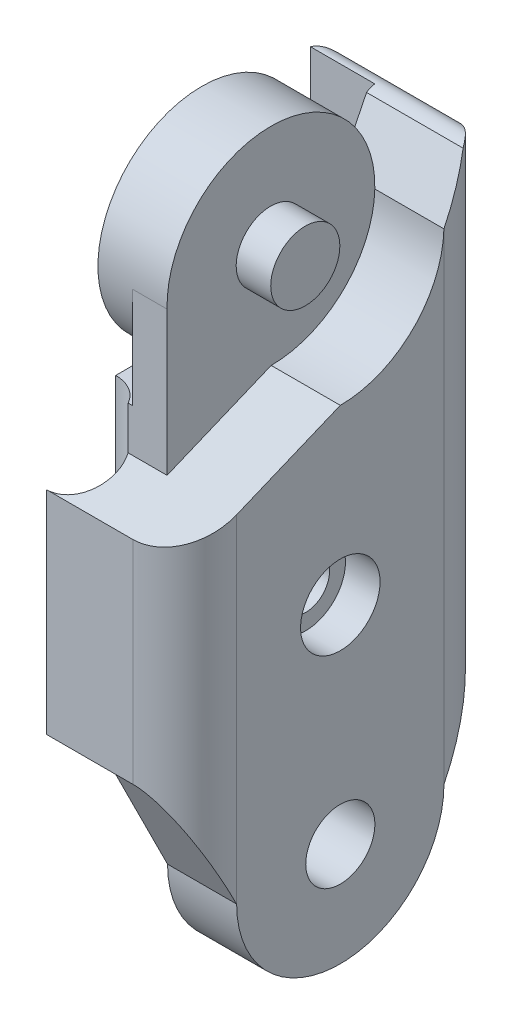
ISO-10303-21;
HEADER;
FILE_DESCRIPTION(('STEP AP214'),'2;1');
FILE_NAME('part.step','',(''),(''),'','','');
FILE_SCHEMA(('AUTOMOTIVE_DESIGN { 1 0 10303 214 1 1 1 1 }'));
ENDSEC;
DATA;
#1=APPLICATION_CONTEXT('core data for automotive mechanical design processes');
#2=APPLICATION_PROTOCOL_DEFINITION('international standard','automotive_design',2000,#1);
#3=PRODUCT_CONTEXT('',#1,'mechanical');
#4=PRODUCT('Part','Part','',(#3));
#5=PRODUCT_RELATED_PRODUCT_CATEGORY('part','',(#4));
#6=PRODUCT_DEFINITION_FORMATION('','',#4);
#7=PRODUCT_DEFINITION_CONTEXT('part definition',#1,'design');
#8=PRODUCT_DEFINITION('design','',#6,#7);
#9=PRODUCT_DEFINITION_SHAPE('','',#8);
#10=(LENGTH_UNIT() NAMED_UNIT(*) SI_UNIT(.MILLI.,.METRE.));
#11=(NAMED_UNIT(*) PLANE_ANGLE_UNIT() SI_UNIT($,.RADIAN.));
#12=(NAMED_UNIT(*) SI_UNIT($,.STERADIAN.) SOLID_ANGLE_UNIT());
#13=UNCERTAINTY_MEASURE_WITH_UNIT(LENGTH_MEASURE(1.E-05),#10,'distance_accuracy_value','');
#14=(GEOMETRIC_REPRESENTATION_CONTEXT(3) GLOBAL_UNCERTAINTY_ASSIGNED_CONTEXT((#13)) GLOBAL_UNIT_ASSIGNED_CONTEXT((#10,
#11,#12)) REPRESENTATION_CONTEXT('',''));
#15=CARTESIAN_POINT('',(0.,0.,0.));
#16=DIRECTION('',(0.,0.,1.));
#17=DIRECTION('',(1.,0.,0.));
#18=AXIS2_PLACEMENT_3D('',#15,#16,#17);
#19=CARTESIAN_POINT('',(10.668,22.86,-19.475319289495));
#20=DIRECTION('',(-1.,0.,0.));
#21=DIRECTION('',(0.,0.,1.));
#22=AXIS2_PLACEMENT_3D('',#19,#20,#21);
#23=CYLINDRICAL_SURFACE('',#22,1.7526);
#24=CARTESIAN_POINT('',(-10.16,22.86,-19.475319289495));
#25=DIRECTION('',(-1.,0.,0.));
#26=DIRECTION('',(0.,0.,1.));
#27=AXIS2_PLACEMENT_3D('',#24,#25,#26);
#28=CIRCLE('',#27,1.7526);
#29=CARTESIAN_POINT('',(-10.16,22.86,-17.722719289495));
#30=VERTEX_POINT('',#29);
#31=EDGE_CURVE('E207',#30,#30,#28,.T.);
#32=ORIENTED_EDGE('',*,*,#31,.T.);
#33=EDGE_LOOP('',(#32));
#34=FACE_BOUND('',#33,.T.);
#35=CARTESIAN_POINT('',(-2.54,22.86,-19.475319289495));
#36=DIRECTION('',(1.,0.,0.));
#37=DIRECTION('',(0.,0.,-1.));
#38=AXIS2_PLACEMENT_3D('',#35,#36,#37);
#39=CIRCLE('',#38,1.7526);
#40=CARTESIAN_POINT('',(-2.54,22.86,-21.227919289495));
#41=VERTEX_POINT('',#40);
#42=EDGE_CURVE('E44',#41,#41,#39,.F.);
#43=ORIENTED_EDGE('',*,*,#42,.F.);
#44=EDGE_LOOP('',(#43));
#45=FACE_BOUND('',#44,.T.);
#46=ADVANCED_FACE('F40',(#34,#45),#23,.F.);
#47=CARTESIAN_POINT('',(-7.61999999999998,35.56,-58.845319289495));
#48=DIRECTION('',(0.,-1.,0.));
#49=DIRECTION('',(0.,0.,-1.));
#50=AXIS2_PLACEMENT_3D('',#47,#48,#49);
#51=PLANE('',#50);
#52=DIRECTION('',(1.,0.,0.));
#53=VECTOR('',#52,1.);
#54=CARTESIAN_POINT('',(-10.16,35.56,-20.1996134735618));
#55=LINE('',#54,#53);
#56=CARTESIAN_POINT('',(-7.61999999999998,35.56,-20.1996134735618));
#57=VERTEX_POINT('',#56);
#58=CARTESIAN_POINT('',(-10.16,35.56,-20.1996134735618));
#59=VERTEX_POINT('',#58);
#60=EDGE_CURVE('E360',#57,#59,#55,.F.);
#61=ORIENTED_EDGE('',*,*,#60,.F.);
#62=DIRECTION('',(0.,0.,1.));
#63=VECTOR('',#62,1.);
#64=CARTESIAN_POINT('',(-7.61999999999998,35.56,-58.845319289495));
#65=LINE('',#64,#63);
#66=CARTESIAN_POINT('',(-7.61999999999998,35.56,-29.635319289495));
#67=VERTEX_POINT('',#66);
#68=EDGE_CURVE('E443',#67,#57,#65,.T.);
#69=ORIENTED_EDGE('',*,*,#68,.F.);
#70=DIRECTION('',(1.,0.,0.));
#71=VECTOR('',#70,1.);
#72=CARTESIAN_POINT('',(-12.7,35.56,-29.635319289495));
#73=LINE('',#72,#71);
#74=CARTESIAN_POINT('',(-10.16,35.56,-29.635319289495));
#75=VERTEX_POINT('',#74);
#76=EDGE_CURVE('E226',#75,#67,#73,.T.);
#77=ORIENTED_EDGE('',*,*,#76,.F.);
#78=CARTESIAN_POINT('',(-10.16,35.56,-28.365319289495));
#79=DIRECTION('',(0.,-1.,0.));
#80=DIRECTION('',(0.,0.,-1.));
#81=AXIS2_PLACEMENT_3D('',#78,#79,#80);
#82=CIRCLE('',#81,1.27);
#83=EDGE_CURVE('E439',#75,#75,#82,.F.);
#84=ORIENTED_EDGE('',*,*,#83,.F.);
#85=CARTESIAN_POINT('',(-12.3597045256125,35.56,-29.635319289495));
#86=VERTEX_POINT('',#85);
#87=EDGE_CURVE('E63',#86,#75,#73,.T.);
#88=ORIENTED_EDGE('',*,*,#87,.F.);
#89=CARTESIAN_POINT('',(-10.16,35.56,-28.365319289495));
#90=DIRECTION('',(0.,-1.,0.));
#91=DIRECTION('',(0.,0.,-1.));
#92=AXIS2_PLACEMENT_3D('',#89,#90,#91);
#93=CIRCLE('',#92,2.54);
#94=CARTESIAN_POINT('',(-10.16,35.56,-25.825319289495));
#95=VERTEX_POINT('',#94);
#96=EDGE_CURVE('E56',#86,#95,#93,.F.);
#97=ORIENTED_EDGE('',*,*,#96,.T.);
#98=DIRECTION('',(0.,0.,1.));
#99=VECTOR('',#98,1.);
#100=CARTESIAN_POINT('',(-10.16,35.56,-58.845319289495));
#101=LINE('',#100,#99);
#102=EDGE_CURVE('E213',#95,#59,#101,.T.);
#103=ORIENTED_EDGE('',*,*,#102,.T.);
#104=EDGE_LOOP('',(#61,#69,#77,#84,#88,#97,#103));
#105=FACE_BOUND('',#104,.T.);
#106=ADVANCED_FACE('F285',(#105),#51,.F.);
#107=CARTESIAN_POINT('',(-7.61999999999998,50.8,-58.845319289495));
#108=DIRECTION('',(1.,0.,0.));
#109=DIRECTION('',(0.,1.,0.));
#110=AXIS2_PLACEMENT_3D('',#107,#108,#109);
#111=PLANE('',#110);
#112=CARTESIAN_POINT('',(-7.61999999999998,43.1619185849693,-19.4572378744643));
#113=DIRECTION('',(-1.,0.,0.));
#114=DIRECTION('',(0.,-1.,0.));
#115=AXIS2_PLACEMENT_3D('',#112,#113,#114);
#116=CIRCLE('',#115,7.63808141503068);
#117=CARTESIAN_POINT('',(-7.61999999999998,42.986705665976,-27.093309386417));
#118=VERTEX_POINT('',#117);
#119=EDGE_CURVE('E367',#118,#57,#116,.T.);
#120=ORIENTED_EDGE('',*,*,#119,.F.);
#121=DIRECTION('',(0.,0.896202517851149,-0.443645181420087));
#122=VECTOR('',#121,1.);
#123=CARTESIAN_POINT('',(-7.61999999999998,42.9857641827755,-27.0928433260378));
#124=LINE('',#123,#122);
#125=CARTESIAN_POINT('',(-7.61999999999998,46.8928820913877,-29.0269753987217));
#126=VERTEX_POINT('',#125);
#127=EDGE_CURVE('E232',#118,#126,#124,.T.);
#128=ORIENTED_EDGE('',*,*,#127,.T.);
#129=CARTESIAN_POINT('',(-7.61999999999998,45.9354329019638,-29.7570594411049));
#130=DIRECTION('',(1.,0.,0.));
#131=DIRECTION('',(0.,0.,-1.));
#132=AXIS2_PLACEMENT_3D('',#129,#130,#131);
#133=CIRCLE('',#132,1.20404803030072);
#134=CARTESIAN_POINT('',(-7.61999999999998,47.1333106063882,-29.635319289495));
#135=VERTEX_POINT('',#134);
#136=EDGE_CURVE('E231',#126,#135,#133,.F.);
#137=ORIENTED_EDGE('',*,*,#136,.T.);
#138=DIRECTION('',(0.,1.,0.));
#139=VECTOR('',#138,1.);
#140=CARTESIAN_POINT('',(-7.61999999999998,35.56,-29.635319289495));
#141=LINE('',#140,#139);
#142=EDGE_CURVE('E228',#67,#135,#141,.T.);
#143=ORIENTED_EDGE('',*,*,#142,.F.);
#144=ORIENTED_EDGE('',*,*,#68,.T.);
#145=EDGE_LOOP('',(#120,#128,#137,#143,#144));
#146=FACE_BOUND('',#145,.T.);
#147=ADVANCED_FACE('F291',(#146),#111,.F.);
#148=CARTESIAN_POINT('',(-7.61999999999998,35.56,-18.7148622753669));
#149=VERTEX_POINT('',#148);
#150=CARTESIAN_POINT('',(-7.61999999999999,35.56,-11.8215590442311));
#151=VERTEX_POINT('',#150);
#152=EDGE_CURVE('E442',#149,#151,#65,.T.);
#153=ORIENTED_EDGE('',*,*,#152,.T.);
#154=DIRECTION('',(0.,1.,0.));
#155=VECTOR('',#154,1.);
#156=CARTESIAN_POINT('',(-7.61999999999999,42.9703552686348,-11.8215590442311));
#157=LINE('',#156,#155);
#158=CARTESIAN_POINT('',(-7.61999999999999,42.9703552686348,-11.8215590442311));
#159=VERTEX_POINT('',#158);
#160=EDGE_CURVE('E198',#151,#159,#157,.T.);
#161=ORIENTED_EDGE('',*,*,#160,.T.);
#162=EDGE_CURVE('E364',#149,#159,#116,.T.);
#163=ORIENTED_EDGE('',*,*,#162,.F.);
#164=EDGE_LOOP('',(#153,#161,#163));
#165=FACE_BOUND('',#164,.T.);
#166=ADVANCED_FACE('F559',(#165),#111,.F.);
#167=CARTESIAN_POINT('',(0.,42.9857641827755,-27.0928433260378));
#168=DIRECTION('',(0.,0.443645181420087,0.896202517851149));
#169=DIRECTION('',(0.,-0.896202517851149,0.443645181420087));
#170=AXIS2_PLACEMENT_3D('',#167,#168,#169);
#171=PLANE('',#170);
#172=ORIENTED_EDGE('',*,*,#127,.F.);
#173=DIRECTION('',(-1.,0.,0.));
#174=VECTOR('',#173,1.);
#175=CARTESIAN_POINT('',(30.48,42.986705665976,-27.093309386417));
#176=LINE('',#175,#174);
#177=CARTESIAN_POINT('',(-5.07999999999999,42.986705665976,-27.093309386417));
#178=VERTEX_POINT('',#177);
#179=EDGE_CURVE('E436',#178,#118,#176,.T.);
#180=ORIENTED_EDGE('',*,*,#179,.F.);
#181=DIRECTION('',(0.,0.896202517851149,-0.443645181420087));
#182=VECTOR('',#181,1.);
#183=CARTESIAN_POINT('',(-5.07999999999998,61.8866490916838,-36.4493072361354));
#184=LINE('',#183,#182);
#185=CARTESIAN_POINT('',(-5.07999999999999,42.9857641827755,-27.0928433260378));
#186=VERTEX_POINT('',#185);
#187=EDGE_CURVE('E434',#186,#178,#184,.T.);
#188=ORIENTED_EDGE('',*,*,#187,.F.);
#189=DIRECTION('',(-1.,0.,0.));
#190=VECTOR('',#189,1.);
#191=CARTESIAN_POINT('',(0.,42.9857641827755,-27.0928433260378));
#192=LINE('',#191,#190);
#193=CARTESIAN_POINT('',(0.,42.9857641827755,-27.0928433260378));
#194=VERTEX_POINT('',#193);
#195=EDGE_CURVE('E420',#194,#186,#192,.T.);
#196=ORIENTED_EDGE('',*,*,#195,.F.);
#197=DIRECTION('',(0.,0.896202517851148,-0.443645181420087));
#198=VECTOR('',#197,1.);
#199=CARTESIAN_POINT('',(0.,42.9857641827755,-27.0928433260378));
#200=LINE('',#199,#198);
#201=CARTESIAN_POINT('',(0.,42.9907658480192,-27.095319289495));
#202=VERTEX_POINT('',#201);
#203=EDGE_CURVE('E415',#194,#202,#200,.T.);
#204=ORIENTED_EDGE('',*,*,#203,.T.);
#205=CARTESIAN_POINT('',(-3.81,42.9907658480192,-27.095319289495));
#206=DIRECTION('',(0.,0.443645181420087,0.896202517851149));
#207=DIRECTION('',(0.,-0.896202517851149,0.443645181420087));
#208=AXIS2_PLACEMENT_3D('',#205,#206,#207);
#209=ELLIPSE('',#208,8.5879440588183,3.81);
#210=CARTESIAN_POINT('',(-0.525977363706627,46.8928820913877,-29.0269753987217));
#211=VERTEX_POINT('',#210);
#212=EDGE_CURVE('E234',#211,#202,#209,.F.);
#213=ORIENTED_EDGE('',*,*,#212,.F.);
#214=DIRECTION('',(-1.,0.,0.));
#215=VECTOR('',#214,1.);
#216=CARTESIAN_POINT('',(0.,46.8928820913877,-29.0269753987217));
#217=LINE('',#216,#215);
#218=EDGE_CURVE('E429',#211,#126,#217,.T.);
#219=ORIENTED_EDGE('',*,*,#218,.T.);
#220=EDGE_LOOP('',(#172,#180,#188,#196,#204,#213,#219));
#221=FACE_BOUND('',#220,.T.);
#222=ADVANCED_FACE('F550',(#221),#171,.T.);
#223=CARTESIAN_POINT('',(30.48,7.62,-19.475319289495));
#224=DIRECTION('',(-1.,0.,0.));
#225=DIRECTION('',(0.,0.,1.));
#226=AXIS2_PLACEMENT_3D('',#223,#224,#225);
#227=CYLINDRICAL_SURFACE('',#226,7.62);
#228=DIRECTION('',(-1.,0.,0.));
#229=VECTOR('',#228,1.);
#230=CARTESIAN_POINT('',(30.48,7.62,-11.855319289495));
#231=LINE('',#230,#229);
#232=CARTESIAN_POINT('',(0.,7.62,-11.855319289495));
#233=VERTEX_POINT('',#232);
#234=CARTESIAN_POINT('',(-5.08,7.62,-11.855319289495));
#235=VERTEX_POINT('',#234);
#236=EDGE_CURVE('E448',#233,#235,#231,.T.);
#237=ORIENTED_EDGE('',*,*,#236,.T.);
#238=CARTESIAN_POINT('',(-5.08,7.62,-19.475319289495));
#239=DIRECTION('',(1.,0.,0.));
#240=DIRECTION('',(0.,0.,-1.));
#241=AXIS2_PLACEMENT_3D('',#238,#239,#240);
#242=CIRCLE('',#241,7.62);
#243=CARTESIAN_POINT('',(-5.08,7.62,-27.095319289495));
#244=VERTEX_POINT('',#243);
#245=EDGE_CURVE('E423',#235,#244,#242,.T.);
#246=ORIENTED_EDGE('',*,*,#245,.T.);
#247=DIRECTION('',(-1.,0.,0.));
#248=VECTOR('',#247,1.);
#249=CARTESIAN_POINT('',(30.48,7.62,-27.095319289495));
#250=LINE('',#249,#248);
#251=CARTESIAN_POINT('',(0.,7.62,-27.095319289495));
#252=VERTEX_POINT('',#251);
#253=EDGE_CURVE('E459',#252,#244,#250,.T.);
#254=ORIENTED_EDGE('',*,*,#253,.F.);
#255=CARTESIAN_POINT('',(0.,7.62,-19.475319289495));
#256=DIRECTION('',(-1.,0.,0.));
#257=DIRECTION('',(0.,0.,1.));
#258=AXIS2_PLACEMENT_3D('',#255,#256,#257);
#259=CIRCLE('',#258,7.62);
#260=EDGE_CURVE('E468',#233,#252,#259,.F.);
#261=ORIENTED_EDGE('',*,*,#260,.F.);
#262=EDGE_LOOP('',(#237,#246,#254,#261));
#263=FACE_BOUND('',#262,.T.);
#264=ADVANCED_FACE('F509',(#263),#227,.T.);
#265=CARTESIAN_POINT('',(30.48,7.62,-27.095319289495));
#266=DIRECTION('',(0.,0.447213595499958,0.894427190999916));
#267=DIRECTION('',(0.,-0.894427190999916,0.447213595499958));
#268=AXIS2_PLACEMENT_3D('',#265,#266,#267);
#269=PLANE('',#268);
#270=ORIENTED_EDGE('',*,*,#253,.T.);
#271=DIRECTION('',(0.,0.894427190999916,-0.447213595499958));
#272=VECTOR('',#271,1.);
#273=CARTESIAN_POINT('',(-5.08,7.62,-27.095319289495));
#274=LINE('',#273,#272);
#275=CARTESIAN_POINT('',(-5.08,15.24,-30.905319289495));
#276=VERTEX_POINT('',#275);
#277=EDGE_CURVE('E418',#244,#276,#274,.T.);
#278=ORIENTED_EDGE('',*,*,#277,.T.);
#279=DIRECTION('',(-1.,0.,0.));
#280=VECTOR('',#279,1.);
#281=CARTESIAN_POINT('',(30.48,15.24,-30.905319289495));
#282=LINE('',#281,#280);
#283=CARTESIAN_POINT('',(-3.81,15.24,-30.905319289495));
#284=VERTEX_POINT('',#283);
#285=EDGE_CURVE('E455',#284,#276,#282,.T.);
#286=ORIENTED_EDGE('',*,*,#285,.F.);
#287=CARTESIAN_POINT('',(-3.81,7.62,-27.095319289495));
#288=DIRECTION('',(0.,0.447213595499958,0.894427190999916));
#289=DIRECTION('',(0.,-0.894427190999916,0.447213595499958));
#290=AXIS2_PLACEMENT_3D('',#287,#288,#289);
#291=ELLIPSE('',#290,8.5194189942742,3.81);
#292=EDGE_CURVE('E465',#252,#284,#291,.T.);
#293=ORIENTED_EDGE('',*,*,#292,.F.);
#294=EDGE_LOOP('',(#270,#278,#286,#293));
#295=FACE_BOUND('',#294,.T.);
#296=ADVANCED_FACE('F513',(#295),#269,.F.);
#297=CARTESIAN_POINT('',(30.48,15.24,-8.04531928949502));
#298=DIRECTION('',(0.,0.447213595499958,-0.894427190999916));
#299=DIRECTION('',(0.,0.894427190999916,0.447213595499958));
#300=AXIS2_PLACEMENT_3D('',#297,#298,#299);
#301=PLANE('',#300);
#302=DIRECTION('',(-1.,0.,0.));
#303=VECTOR('',#302,1.);
#304=CARTESIAN_POINT('',(30.48,15.24,-8.04531928949502));
#305=LINE('',#304,#303);
#306=CARTESIAN_POINT('',(-3.81,15.24,-8.04531928949502));
#307=VERTEX_POINT('',#306);
#308=CARTESIAN_POINT('',(-5.08,15.24,-8.04531928949501));
#309=VERTEX_POINT('',#308);
#310=EDGE_CURVE('E452',#307,#309,#305,.T.);
#311=ORIENTED_EDGE('',*,*,#310,.T.);
#312=DIRECTION('',(0.,-0.894427190999916,-0.447213595499958));
#313=VECTOR('',#312,1.);
#314=CARTESIAN_POINT('',(-5.08,15.24,-8.04531928949502));
#315=LINE('',#314,#313);
#316=EDGE_CURVE('E480',#309,#235,#315,.T.);
#317=ORIENTED_EDGE('',*,*,#316,.T.);
#318=ORIENTED_EDGE('',*,*,#236,.F.);
#319=CARTESIAN_POINT('',(-3.81,7.62000000000001,-11.855319289495));
#320=DIRECTION('',(0.,0.447213595499958,-0.894427190999916));
#321=DIRECTION('',(0.,-0.894427190999916,-0.447213595499958));
#322=AXIS2_PLACEMENT_3D('',#319,#320,#321);
#323=ELLIPSE('',#322,8.5194189942742,3.81);
#324=EDGE_CURVE('E451',#307,#233,#323,.T.);
#325=ORIENTED_EDGE('',*,*,#324,.F.);
#326=EDGE_LOOP('',(#311,#317,#318,#325));
#327=FACE_BOUND('',#326,.T.);
#328=ADVANCED_FACE('F504',(#327),#301,.F.);
#329=CARTESIAN_POINT('',(-10.16,35.56,-10.585319289495));
#330=DIRECTION('',(0.,-1.,0.));
#331=DIRECTION('',(0.,0.,-1.));
#332=AXIS2_PLACEMENT_3D('',#329,#330,#331);
#333=CIRCLE('',#332,2.54);
#334=CARTESIAN_POINT('',(-10.16,35.56,-13.125319289495));
#335=VERTEX_POINT('',#334);
#336=CARTESIAN_POINT('',(-7.94114640663019,35.56,-11.8215590442311));
#337=VERTEX_POINT('',#336);
#338=EDGE_CURVE('E338',#335,#337,#333,.T.);
#339=ORIENTED_EDGE('',*,*,#338,.T.);
#340=DIRECTION('',(1.,0.,0.));
#341=VECTOR('',#340,1.);
#342=CARTESIAN_POINT('',(-14.986,35.56,-11.8215590442311));
#343=LINE('',#342,#341);
#344=EDGE_CURVE('E199',#337,#151,#343,.T.);
#345=ORIENTED_EDGE('',*,*,#344,.T.);
#346=ORIENTED_EDGE('',*,*,#152,.F.);
#347=DIRECTION('',(1.,0.,0.));
#348=VECTOR('',#347,1.);
#349=CARTESIAN_POINT('',(-10.16,35.56,-18.7148622753669));
#350=LINE('',#349,#348);
#351=CARTESIAN_POINT('',(-10.16,35.56,-18.7148622753669));
#352=VERTEX_POINT('',#351);
#353=EDGE_CURVE('E345',#352,#149,#350,.T.);
#354=ORIENTED_EDGE('',*,*,#353,.F.);
#355=EDGE_CURVE('E219',#352,#335,#101,.T.);
#356=ORIENTED_EDGE('',*,*,#355,.T.);
#357=EDGE_LOOP('',(#339,#345,#346,#354,#356));
#358=FACE_BOUND('',#357,.T.);
#359=ADVANCED_FACE('F294',(#358),#51,.F.);
#360=CARTESIAN_POINT('',(30.48,43.1619185849693,-19.4572378744643));
#361=DIRECTION('',(-1.,0.,0.));
#362=DIRECTION('',(0.,0.,1.));
#363=AXIS2_PLACEMENT_3D('',#360,#361,#362);
#364=CYLINDRICAL_SURFACE('',#363,7.63808141503068);
#365=CARTESIAN_POINT('',(-5.07999999999999,43.1619185849693,-19.4572378744643));
#366=DIRECTION('',(-1.,0.,0.));
#367=DIRECTION('',(0.,-1.,0.));
#368=AXIS2_PLACEMENT_3D('',#365,#366,#367);
#369=CIRCLE('',#368,7.63808141503068);
#370=CARTESIAN_POINT('',(-5.07999999999999,42.9703552686348,-11.8215590442311));
#371=VERTEX_POINT('',#370);
#372=EDGE_CURVE('E195',#371,#178,#369,.T.);
#373=ORIENTED_EDGE('',*,*,#372,.T.);
#374=ORIENTED_EDGE('',*,*,#179,.T.);
#375=ORIENTED_EDGE('',*,*,#119,.T.);
#376=ORIENTED_EDGE('',*,*,#60,.T.);
#377=CARTESIAN_POINT('',(-10.16,43.1619185849693,-19.4572378744643));
#378=DIRECTION('',(-1.,0.,0.));
#379=DIRECTION('',(0.,-1.,0.));
#380=AXIS2_PLACEMENT_3D('',#377,#378,#379);
#381=CIRCLE('',#380,7.63808141503068);
#382=EDGE_CURVE('E363',#352,#59,#381,.T.);
#383=ORIENTED_EDGE('',*,*,#382,.F.);
#384=ORIENTED_EDGE('',*,*,#353,.T.);
#385=ORIENTED_EDGE('',*,*,#162,.T.);
#386=DIRECTION('',(-1.,0.,0.));
#387=VECTOR('',#386,1.);
#388=CARTESIAN_POINT('',(30.48,42.9703552686348,-11.8215590442311));
#389=LINE('',#388,#387);
#390=EDGE_CURVE('E447',#371,#159,#389,.T.);
#391=ORIENTED_EDGE('',*,*,#390,.F.);
#392=EDGE_LOOP('',(#373,#374,#375,#376,#383,#384,#385,#391));
#393=FACE_BOUND('',#392,.T.);
#394=ADVANCED_FACE('F554',(#393),#364,.T.);
#395=CARTESIAN_POINT('',(-16.51,50.8,-8.04531928949501));
#396=DIRECTION('',(0.,0.,-1.));
#397=DIRECTION('',(-1.,0.,0.));
#398=AXIS2_PLACEMENT_3D('',#395,#396,#397);
#399=PLANE('',#398);
#400=DIRECTION('',(-1.,0.,0.));
#401=VECTOR('',#400,1.);
#402=CARTESIAN_POINT('',(0.,30.825459319999,-8.04531928949501));
#403=LINE('',#402,#401);
#404=CARTESIAN_POINT('',(-3.81,30.825459319999,-8.04531928949501));
#405=VERTEX_POINT('',#404);
#406=CARTESIAN_POINT('',(-10.16,30.825459319999,-8.04531928949501));
#407=VERTEX_POINT('',#406);
#408=EDGE_CURVE('E216',#405,#407,#403,.T.);
#409=ORIENTED_EDGE('',*,*,#408,.T.);
#410=DIRECTION('',(0.,1.,0.));
#411=VECTOR('',#410,1.);
#412=CARTESIAN_POINT('',(-10.16,-5.20699999999999,-8.04531928949501));
#413=LINE('',#412,#411);
#414=CARTESIAN_POINT('',(-10.16,15.24,-8.04531928949501));
#415=VERTEX_POINT('',#414);
#416=EDGE_CURVE('E355',#415,#407,#413,.T.);
#417=ORIENTED_EDGE('',*,*,#416,.F.);
#418=DIRECTION('',(-1.,0.,0.));
#419=VECTOR('',#418,1.);
#420=CARTESIAN_POINT('',(-5.08,15.24,-8.04531928949501));
#421=LINE('',#420,#419);
#422=EDGE_CURVE('E502',#309,#415,#421,.T.);
#423=ORIENTED_EDGE('',*,*,#422,.F.);
#424=ORIENTED_EDGE('',*,*,#310,.F.);
#425=DIRECTION('',(0.,-1.,0.));
#426=VECTOR('',#425,1.);
#427=CARTESIAN_POINT('',(-3.81,50.8,-8.04531928949501));
#428=LINE('',#427,#426);
#429=EDGE_CURVE('E478',#405,#307,#428,.T.);
#430=ORIENTED_EDGE('',*,*,#429,.F.);
#431=EDGE_LOOP('',(#409,#417,#423,#424,#430));
#432=FACE_BOUND('',#431,.T.);
#433=ADVANCED_FACE('F42',(#432),#399,.F.);
#434=CARTESIAN_POINT('',(-3.81,50.8,-11.855319289495));
#435=DIRECTION('',(0.,-1.,0.));
#436=DIRECTION('',(0.,0.,-1.));
#437=AXIS2_PLACEMENT_3D('',#434,#435,#436);
#438=CYLINDRICAL_SURFACE('',#437,3.81);
#439=DIRECTION('',(0.,-1.,0.));
#440=VECTOR('',#439,1.);
#441=CARTESIAN_POINT('',(0.,50.8,-11.855319289495));
#442=LINE('',#441,#440);
#443=CARTESIAN_POINT('',(0.,32.403639546666,-11.855319289495));
#444=VERTEX_POINT('',#443);
#445=EDGE_CURVE('E476',#444,#233,#442,.T.);
#446=ORIENTED_EDGE('',*,*,#445,.F.);
#447=CARTESIAN_POINT('',(-3.81,32.403639546666,-11.855319289495));
#448=DIRECTION('',(0.,-0.923877255958141,-0.382688928404332));
#449=DIRECTION('',(0.,-0.382688928404332,0.923877255958141));
#450=AXIS2_PLACEMENT_3D('',#447,#448,#449);
#451=ELLIPSE('',#450,4.12392444497262,3.81);
#452=EDGE_CURVE('E223',#444,#405,#451,.T.);
#453=ORIENTED_EDGE('',*,*,#452,.T.);
#454=ORIENTED_EDGE('',*,*,#429,.T.);
#455=ORIENTED_EDGE('',*,*,#324,.T.);
#456=EDGE_LOOP('',(#446,#453,#454,#455));
#457=FACE_BOUND('',#456,.T.);
#458=ADVANCED_FACE('F403',(#457),#438,.T.);
#459=CARTESIAN_POINT('',(0.,50.8,-27.095319289495));
#460=DIRECTION('',(-1.,0.,0.));
#461=DIRECTION('',(0.,0.,1.));
#462=AXIS2_PLACEMENT_3D('',#459,#460,#461);
#463=PLANE('',#462);
#464=CARTESIAN_POINT('',(0.,22.86,-19.475319289495));
#465=DIRECTION('',(1.,0.,0.));
#466=DIRECTION('',(0.,0.,-1.));
#467=AXIS2_PLACEMENT_3D('',#464,#465,#466);
#468=CIRCLE('',#467,2.921);
#469=CARTESIAN_POINT('',(0.,22.86,-22.396319289495));
#470=VERTEX_POINT('',#469);
#471=EDGE_CURVE('E379',#470,#470,#468,.T.);
#472=ORIENTED_EDGE('',*,*,#471,.F.);
#473=EDGE_LOOP('',(#472));
#474=FACE_BOUND('',#473,.T.);
#475=CARTESIAN_POINT('',(0.,7.62,-19.475319289495));
#476=DIRECTION('',(-1.,0.,0.));
#477=DIRECTION('',(0.,0.,1.));
#478=AXIS2_PLACEMENT_3D('',#475,#476,#477);
#479=CIRCLE('',#478,2.54);
#480=CARTESIAN_POINT('',(0.,7.62,-16.935319289495));
#481=VERTEX_POINT('',#480);
#482=EDGE_CURVE('E408',#481,#481,#479,.T.);
#483=ORIENTED_EDGE('',*,*,#482,.T.);
#484=EDGE_LOOP('',(#483));
#485=FACE_BOUND('',#484,.T.);
#486=CARTESIAN_POINT('',(0.,43.18,-19.475319289495));
#487=DIRECTION('',(1.,0.,0.));
#488=DIRECTION('',(0.,0.,-1.));
#489=AXIS2_PLACEMENT_3D('',#486,#487,#488);
#490=CIRCLE('',#489,7.62);
#491=CARTESIAN_POINT('',(0.,35.56,-19.475319289495));
#492=VERTEX_POINT('',#491);
#493=EDGE_CURVE('E412',#492,#194,#490,.T.);
#494=ORIENTED_EDGE('',*,*,#493,.F.);
#495=DIRECTION('',(0.,-0.382688928404332,0.923877255958141));
#496=VECTOR('',#495,1.);
#497=CARTESIAN_POINT('',(0.,35.56,-19.4753192894949));
#498=LINE('',#497,#496);
#499=EDGE_CURVE('E212',#492,#444,#498,.T.);
#500=ORIENTED_EDGE('',*,*,#499,.T.);
#501=ORIENTED_EDGE('',*,*,#445,.T.);
#502=ORIENTED_EDGE('',*,*,#260,.T.);
#503=DIRECTION('',(0.,-1.,0.));
#504=VECTOR('',#503,1.);
#505=CARTESIAN_POINT('',(0.,50.8,-27.095319289495));
#506=LINE('',#505,#504);
#507=EDGE_CURVE('E474',#202,#252,#506,.T.);
#508=ORIENTED_EDGE('',*,*,#507,.F.);
#509=ORIENTED_EDGE('',*,*,#203,.F.);
#510=EDGE_LOOP('',(#494,#500,#501,#502,#508,#509));
#511=FACE_BOUND('',#510,.T.);
#512=ADVANCED_FACE('F399',(#474,#485,#511),#463,.F.);
#513=CARTESIAN_POINT('',(-3.81,50.8,-27.095319289495));
#514=DIRECTION('',(0.,-1.,0.));
#515=DIRECTION('',(0.,0.,-1.));
#516=AXIS2_PLACEMENT_3D('',#513,#514,#515);
#517=CYLINDRICAL_SURFACE('',#516,3.81);
#518=DIRECTION('',(0.,-1.,0.));
#519=VECTOR('',#518,1.);
#520=CARTESIAN_POINT('',(-3.81,50.8,-30.905319289495));
#521=LINE('',#520,#519);
#522=CARTESIAN_POINT('',(-3.81,46.2976910693611,-30.905319289495));
#523=VERTEX_POINT('',#522);
#524=EDGE_CURVE('E471',#523,#284,#521,.T.);
#525=ORIENTED_EDGE('',*,*,#524,.F.);
#526=CARTESIAN_POINT('',(-3.81,46.2976910693611,-30.905319289495));
#527=CARTESIAN_POINT('',(-3.75773450702308,46.2975334786751,-30.9053310882101));
#528=CARTESIAN_POINT('',(-3.70565553611502,46.3011182956063,-30.9042447172749));
#529=CARTESIAN_POINT('',(-3.6026452321905,46.3141776032544,-30.9000161300388));
#530=CARTESIAN_POINT('',(-3.5517086058069,46.323613226519,-30.8968874736571));
#531=CARTESIAN_POINT('',(-3.45141079127355,46.3467367289691,-30.8887401275739));
#532=CARTESIAN_POINT('',(-3.40204108200512,46.3603944361774,-30.883734796639));
#533=CARTESIAN_POINT('',(-3.30428923442597,46.3904729018125,-30.8719290767673));
#534=CARTESIAN_POINT('',(-3.25590912632452,46.4068988043856,-30.8651253322));
#535=CARTESIAN_POINT('',(-3.15236005200748,46.444202248576,-30.8485558249016));
#536=CARTESIAN_POINT('',(-3.09734584930216,46.4653713215997,-30.8384900948101));
#537=CARTESIAN_POINT('',(-2.9882527725949,46.5088847889436,-30.816062498232));
#538=CARTESIAN_POINT('',(-2.93417417133707,46.5312295185646,-30.8036999741202));
#539=CARTESIAN_POINT('',(-2.7730699925944,46.5989224354182,-30.7631739395574));
#540=CARTESIAN_POINT('',(-2.66716822261845,46.6449324212602,-30.7315707033443));
#541=CARTESIAN_POINT('',(-2.45726807592674,46.7354024247712,-30.6588291203663));
#542=CARTESIAN_POINT('',(-2.35328287237385,46.7798528608801,-30.6176407900658));
#543=CARTESIAN_POINT('',(-2.14797397731836,46.8644515278181,-30.5255398548533));
#544=CARTESIAN_POINT('',(-2.04664815074623,46.9046032948632,-30.4746353402179));
#545=CARTESIAN_POINT('',(-1.83440162240406,46.9828726172385,-30.3556464771975));
#546=CARTESIAN_POINT('',(-1.7238961557532,47.0200845987694,-30.2862014605618));
#547=CARTESIAN_POINT('',(-1.50837825688446,47.0817543545553,-30.1343861085361));
#548=CARTESIAN_POINT('',(-1.40335619111522,47.1062352238258,-30.0520395331243));
#549=CARTESIAN_POINT('',(-1.22349274884876,47.1336148681527,-29.8947888086928));
#550=CARTESIAN_POINT('',(-1.14712242301716,47.1400952557762,-29.8222824031482));
#551=CARTESIAN_POINT('',(-1.00070189545903,47.1387778231642,-29.6711567083825));
#552=CARTESIAN_POINT('',(-0.930643594499392,47.1309985819245,-29.5925455009408));
#553=CARTESIAN_POINT('',(-0.814448152287725,47.1016104287909,-29.4509716856952));
#554=CARTESIAN_POINT('',(-0.766562726630664,47.0836892604366,-29.3886829180789));
#555=CARTESIAN_POINT('',(-0.676771817954837,47.0360660959068,-29.2643769855425));
#556=CARTESIAN_POINT('',(-0.634849898984005,47.0063973670471,-29.2023595494005));
#557=CARTESIAN_POINT('',(-0.583914312989285,46.9588825771594,-29.1223909693907));
#558=CARTESIAN_POINT('',(-0.571811615296384,46.9466018574631,-29.102990884004));
#559=CARTESIAN_POINT('',(-0.548341273807081,46.9207282056881,-29.0646299099055));
#560=CARTESIAN_POINT('',(-0.536973560019156,46.9071353988659,-29.0456689794842));
#561=CARTESIAN_POINT('',(-0.525977363706628,46.8928820913877,-29.0269753987217));
#562=B_SPLINE_CURVE_WITH_KNOTS('',3,(#526,#527,#528,#529,#530,#531,#532,#533,#534,#535,#536,
#537,#538,#539,#540,#541,#542,#543,#544,#545,#546,#547,#548,#549,#550,#551,#552,#553,#554,#555,
#556,#557,#558,#559,#560,#561),.UNSPECIFIED.,.F.,.F.,(4,2,2,2,2,2,2,2,2,2,2,2,2,2,2,2,2,4),(0.,
0.156370870478554,0.31171392189026,0.465971561801884,0.620519085578337,0.799837703945504,
0.979207744715587,1.33792242473423,1.69855136312198,2.05888131998908,2.46496201815232,
2.8703034686092,3.18577623068583,3.50083825264854,3.74171366058017,3.98191176904904,
4.05973962639877,4.13756006135752),.UNSPECIFIED.);
#563=EDGE_CURVE('E238',#523,#211,#562,.T.);
#564=ORIENTED_EDGE('',*,*,#563,.T.);
#565=ORIENTED_EDGE('',*,*,#212,.T.);
#566=ORIENTED_EDGE('',*,*,#507,.T.);
#567=ORIENTED_EDGE('',*,*,#292,.T.);
#568=EDGE_LOOP('',(#525,#564,#565,#566,#567));
#569=FACE_BOUND('',#568,.T.);
#570=ADVANCED_FACE('F402',(#569),#517,.T.);
#571=CARTESIAN_POINT('',(-16.51,50.8,-30.905319289495));
#572=DIRECTION('',(0.,0.,1.));
#573=DIRECTION('',(1.,0.,0.));
#574=AXIS2_PLACEMENT_3D('',#571,#572,#573);
#575=PLANE('',#574);
#576=CARTESIAN_POINT('',(-10.16,15.24,-30.905319289495));
#577=VERTEX_POINT('',#576);
#578=EDGE_CURVE('E458',#276,#577,#282,.T.);
#579=ORIENTED_EDGE('',*,*,#578,.T.);
#580=DIRECTION('',(0.,1.,0.));
#581=VECTOR('',#580,1.);
#582=CARTESIAN_POINT('',(-10.16,-5.20699999999999,-30.905319289495));
#583=LINE('',#582,#581);
#584=CARTESIAN_POINT('',(-10.16,46.2976910693611,-30.905319289495));
#585=VERTEX_POINT('',#584);
#586=EDGE_CURVE('E332',#577,#585,#583,.T.);
#587=ORIENTED_EDGE('',*,*,#586,.T.);
#588=DIRECTION('',(-1.,0.,0.));
#589=VECTOR('',#588,1.);
#590=CARTESIAN_POINT('',(0.,46.2976910693611,-30.905319289495));
#591=LINE('',#590,#589);
#592=EDGE_CURVE('E246',#585,#523,#591,.F.);
#593=ORIENTED_EDGE('',*,*,#592,.T.);
#594=ORIENTED_EDGE('',*,*,#524,.T.);
#595=ORIENTED_EDGE('',*,*,#285,.T.);
#596=EDGE_LOOP('',(#579,#587,#593,#594,#595));
#597=FACE_BOUND('',#596,.T.);
#598=ADVANCED_FACE('F519',(#597),#575,.F.);
#599=CARTESIAN_POINT('',(-5.07999999999999,50.8,-58.845319289495));
#600=DIRECTION('',(-1.,0.,0.));
#601=DIRECTION('',(0.,-1.,0.));
#602=AXIS2_PLACEMENT_3D('',#599,#600,#601);
#603=PLANE('',#602);
#604=CARTESIAN_POINT('',(-5.07999999999999,43.179995622432,-19.4415590442311));
#605=DIRECTION('',(-1.,0.,0.));
#606=DIRECTION('',(0.,-1.,0.));
#607=AXIS2_PLACEMENT_3D('',#604,#605,#606);
#608=CIRCLE('',#607,2.54);
#609=CARTESIAN_POINT('',(-5.07999999999999,40.639995622432,-19.4415590442311));
#610=VERTEX_POINT('',#609);
#611=EDGE_CURVE('E483',#610,#610,#608,.F.);
#612=ORIENTED_EDGE('',*,*,#611,.F.);
#613=EDGE_LOOP('',(#612));
#614=FACE_BOUND('',#613,.T.);
#615=DIRECTION('',(0.,1.,0.));
#616=VECTOR('',#615,1.);
#617=CARTESIAN_POINT('',(-5.07999999999999,42.9703552686348,-11.8215590442311));
#618=LINE('',#617,#616);
#619=CARTESIAN_POINT('',(-5.07999999999999,32.3896553599146,-11.8215590442311));
#620=VERTEX_POINT('',#619);
#621=EDGE_CURVE('E188',#620,#371,#618,.T.);
#622=ORIENTED_EDGE('',*,*,#621,.F.);
#623=DIRECTION('',(0.,-0.382688928404332,0.923877255958141));
#624=VECTOR('',#623,1.);
#625=CARTESIAN_POINT('',(-5.08,35.56,-19.4753192894949));
#626=LINE('',#625,#624);
#627=CARTESIAN_POINT('',(-5.08,35.56,-19.4753192894949));
#628=VERTEX_POINT('',#627);
#629=EDGE_CURVE('E192',#628,#620,#626,.T.);
#630=ORIENTED_EDGE('',*,*,#629,.F.);
#631=CARTESIAN_POINT('',(-5.07999999999999,43.18,-19.475319289495));
#632=DIRECTION('',(-1.,0.,0.));
#633=DIRECTION('',(0.,-1.,0.));
#634=AXIS2_PLACEMENT_3D('',#631,#632,#633);
#635=CIRCLE('',#634,7.62);
#636=EDGE_CURVE('E428',#628,#186,#635,.F.);
#637=ORIENTED_EDGE('',*,*,#636,.T.);
#638=ORIENTED_EDGE('',*,*,#187,.T.);
#639=ORIENTED_EDGE('',*,*,#372,.F.);
#640=EDGE_LOOP('',(#622,#630,#637,#638,#639));
#641=FACE_BOUND('',#640,.T.);
#642=ADVANCED_FACE('F190',(#614,#641),#603,.F.);
#643=CARTESIAN_POINT('',(0.,45.9354329019638,-29.7570594411049));
#644=DIRECTION('',(-1.,0.,0.));
#645=DIRECTION('',(0.,0.,1.));
#646=AXIS2_PLACEMENT_3D('',#643,#644,#645);
#647=CYLINDRICAL_SURFACE('',#646,1.20404803030072);
#648=CARTESIAN_POINT('',(-12.6123073202849,46.8928820913877,-29.0269753987217));
#649=CARTESIAN_POINT('',(-12.6053445658986,46.9125682578616,-29.052787697571));
#650=CARTESIAN_POINT('',(-12.5977571257562,46.9311136452134,-29.0792798777998));
#651=CARTESIAN_POINT('',(-12.5812627284037,46.9658512350777,-29.133359396152));
#652=CARTESIAN_POINT('',(-12.5723562298676,46.9820442517144,-29.16094635116));
#653=CARTESIAN_POINT('',(-12.5436672580292,47.0268161406415,-29.2446242722278));
#654=CARTESIAN_POINT('',(-12.5218285431337,47.0518395393242,-29.3019669461391));
#655=CARTESIAN_POINT('',(-12.472650839726,47.0922478814701,-29.4175513412566));
#656=CARTESIAN_POINT('',(-12.4453159990183,47.107640057597,-29.4757923540855));
#657=CARTESIAN_POINT('',(-12.3854817572503,47.1294697421937,-29.5913186991002));
#658=CARTESIAN_POINT('',(-12.3529769141645,47.1358977444043,-29.6486029531831));
#659=CARTESIAN_POINT('',(-12.2724258791882,47.1415527133676,-29.7783909349103));
#660=CARTESIAN_POINT('',(-12.2227138188073,47.137863643709,-29.8499863827916));
#661=CARTESIAN_POINT('',(-12.1169981279089,47.1193792430827,-29.9868260544464));
#662=CARTESIAN_POINT('',(-12.0609821388005,47.1045617611349,-30.0520573173874));
#663=CARTESIAN_POINT('',(-11.9216080775967,47.0590233853869,-30.1989353652381));
#664=CARTESIAN_POINT('',(-11.8360254725726,47.0243762273216,-30.2772349374492));
#665=CARTESIAN_POINT('',(-11.658330421083,46.9441936743254,-30.4194930093326));
#666=CARTESIAN_POINT('',(-11.5662064047085,46.8986386310773,-30.4834252216105));
#667=CARTESIAN_POINT('',(-11.4044101818166,46.8150430057112,-30.5809931737198));
#668=CARTESIAN_POINT('',(-11.3359151642943,46.7786181071974,-30.6180510399441));
#669=CARTESIAN_POINT('',(-11.1966337018458,46.7037858353833,-30.6854452370223));
#670=CARTESIAN_POINT('',(-11.1258450522709,46.6653765322375,-30.7157748669363));
#671=CARTESIAN_POINT('',(-10.9819063198211,46.5882054454112,-30.7698973665447));
#672=CARTESIAN_POINT('',(-10.9087536546065,46.5494433119525,-30.7936827980387));
#673=CARTESIAN_POINT('',(-10.7596268428608,46.4740952123029,-30.8347379340041));
#674=CARTESIAN_POINT('',(-10.6836575386198,46.4375057692009,-30.85201829879));
#675=CARTESIAN_POINT('',(-10.550086196952,46.3812449090062,-30.8758193257579));
#676=CARTESIAN_POINT('',(-10.4935731994431,46.3597489053442,-30.884007763411));
#677=CARTESIAN_POINT('',(-10.3779992265607,46.3247280752576,-30.8965980585902));
#678=CARTESIAN_POINT('',(-10.3189679786976,46.3111285845456,-30.9010355712484));
#679=CARTESIAN_POINT('',(-10.22629206472,46.2997298448657,-30.904673008846));
#680=CARTESIAN_POINT('',(-10.1932069289812,46.2975706005732,-30.905332573925));
#681=CARTESIAN_POINT('',(-10.16,46.2976910693611,-30.905319289495));
#682=B_SPLINE_CURVE_WITH_KNOTS('',3,(#648,#649,#650,#651,#652,#653,#654,#655,#656,#657,#658,
#659,#660,#661,#662,#663,#664,#665,#666,#667,#668,#669,#670,#671,#672,#673,#674,#675,#676,#677,
#678,#679,#680,#681),.UNSPECIFIED.,.F.,.F.,(4,2,2,2,2,2,2,2,2,2,2,2,2,2,2,2,4),(0.,
0.0995377959844945,0.199041060770278,0.396782390777229,0.594375046154834,0.792177084158866,
1.05246058665521,1.31326355822994,1.6744624421684,2.03631691224253,2.29393158046175,
2.55180167768348,2.80996367303007,3.067700738943,3.25042876169493,3.4313996445155,
3.53074055336119),.UNSPECIFIED.);
#683=CARTESIAN_POINT('',(-12.3597045256125,47.1333106063882,-29.635319289495));
#684=VERTEX_POINT('',#683);
#685=EDGE_CURVE('E324',#684,#585,#682,.T.);
#686=ORIENTED_EDGE('',*,*,#685,.F.);
#687=DIRECTION('',(-1.,0.,0.));
#688=VECTOR('',#687,1.);
#689=CARTESIAN_POINT('',(0.,47.1333106063882,-29.635319289495));
#690=LINE('',#689,#688);
#691=EDGE_CURVE('E486',#135,#684,#690,.T.);
#692=ORIENTED_EDGE('',*,*,#691,.F.);
#693=ORIENTED_EDGE('',*,*,#136,.F.);
#694=ORIENTED_EDGE('',*,*,#218,.F.);
#695=ORIENTED_EDGE('',*,*,#563,.F.);
#696=ORIENTED_EDGE('',*,*,#592,.F.);
#697=EDGE_LOOP('',(#686,#692,#693,#694,#695,#696));
#698=FACE_BOUND('',#697,.T.);
#699=ADVANCED_FACE('F248',(#698),#647,.T.);
#700=CARTESIAN_POINT('',(0.,43.18,-19.475319289495));
#701=DIRECTION('',(-1.,0.,0.));
#702=DIRECTION('',(0.,0.,1.));
#703=AXIS2_PLACEMENT_3D('',#700,#701,#702);
#704=CYLINDRICAL_SURFACE('',#703,7.62);
#705=ORIENTED_EDGE('',*,*,#636,.F.);
#706=DIRECTION('',(-1.,0.,0.));
#707=VECTOR('',#706,1.);
#708=CARTESIAN_POINT('',(0.,35.56,-19.475319289495));
#709=LINE('',#708,#707);
#710=EDGE_CURVE('E211',#492,#628,#709,.T.);
#711=ORIENTED_EDGE('',*,*,#710,.F.);
#712=ORIENTED_EDGE('',*,*,#493,.T.);
#713=ORIENTED_EDGE('',*,*,#195,.T.);
#714=EDGE_LOOP('',(#705,#711,#712,#713));
#715=FACE_BOUND('',#714,.T.);
#716=ADVANCED_FACE('F273',(#715),#704,.F.);
#717=CARTESIAN_POINT('',(-5.08,0.,-58.845319289495));
#718=DIRECTION('',(1.,0.,0.));
#719=DIRECTION('',(0.,0.,-1.));
#720=AXIS2_PLACEMENT_3D('',#717,#718,#719);
#721=PLANE('',#720);
#722=CARTESIAN_POINT('',(-5.08,7.62,-19.475319289495));
#723=DIRECTION('',(1.,0.,0.));
#724=DIRECTION('',(0.,0.,-1.));
#725=AXIS2_PLACEMENT_3D('',#722,#723,#724);
#726=CIRCLE('',#725,2.54);
#727=CARTESIAN_POINT('',(-5.08,7.62,-22.015319289495));
#728=VERTEX_POINT('',#727);
#729=EDGE_CURVE('E526',#728,#728,#726,.T.);
#730=ORIENTED_EDGE('',*,*,#729,.T.);
#731=EDGE_LOOP('',(#730));
#732=FACE_BOUND('',#731,.T.);
#733=ORIENTED_EDGE('',*,*,#245,.F.);
#734=ORIENTED_EDGE('',*,*,#316,.F.);
#735=DIRECTION('',(0.,0.,1.));
#736=VECTOR('',#735,1.);
#737=CARTESIAN_POINT('',(-5.08,15.24,-58.845319289495));
#738=LINE('',#737,#736);
#739=EDGE_CURVE('E534',#276,#309,#738,.T.);
#740=ORIENTED_EDGE('',*,*,#739,.F.);
#741=ORIENTED_EDGE('',*,*,#277,.F.);
#742=EDGE_LOOP('',(#733,#734,#740,#741));
#743=FACE_BOUND('',#742,.T.);
#744=ADVANCED_FACE('F270',(#732,#743),#721,.F.);
#745=CARTESIAN_POINT('',(-5.08,15.24,-58.845319289495));
#746=DIRECTION('',(0.,1.,0.));
#747=DIRECTION('',(-1.,0.,0.));
#748=AXIS2_PLACEMENT_3D('',#745,#746,#747);
#749=PLANE('',#748);
#750=CARTESIAN_POINT('',(-10.16,15.24,-28.365319289495));
#751=DIRECTION('',(0.,1.,0.));
#752=DIRECTION('',(-1.,0.,0.));
#753=AXIS2_PLACEMENT_3D('',#750,#751,#752);
#754=CIRCLE('',#753,1.27);
#755=CARTESIAN_POINT('',(-11.43,15.24,-28.365319289495));
#756=VERTEX_POINT('',#755);
#757=EDGE_CURVE('E537',#756,#756,#754,.F.);
#758=ORIENTED_EDGE('',*,*,#757,.F.);
#759=EDGE_LOOP('',(#758));
#760=FACE_BOUND('',#759,.T.);
#761=DIRECTION('',(0.,0.,-1.));
#762=VECTOR('',#761,1.);
#763=CARTESIAN_POINT('',(-10.16,15.24,-58.845319289495));
#764=LINE('',#763,#762);
#765=CARTESIAN_POINT('',(-10.16,15.24,-13.125319289495));
#766=VERTEX_POINT('',#765);
#767=CARTESIAN_POINT('',(-10.16,15.24,-25.825319289495));
#768=VERTEX_POINT('',#767);
#769=EDGE_CURVE('E354',#766,#768,#764,.T.);
#770=ORIENTED_EDGE('',*,*,#769,.T.);
#771=CARTESIAN_POINT('',(-10.16,15.24,-28.365319289495));
#772=DIRECTION('',(0.,1.,0.));
#773=DIRECTION('',(-1.,0.,0.));
#774=AXIS2_PLACEMENT_3D('',#771,#772,#773);
#775=CIRCLE('',#774,2.54);
#776=EDGE_CURVE('E335',#768,#577,#775,.F.);
#777=ORIENTED_EDGE('',*,*,#776,.T.);
#778=ORIENTED_EDGE('',*,*,#578,.F.);
#779=ORIENTED_EDGE('',*,*,#739,.T.);
#780=ORIENTED_EDGE('',*,*,#422,.T.);
#781=CARTESIAN_POINT('',(-10.16,15.24,-10.585319289495));
#782=DIRECTION('',(0.,1.,0.));
#783=DIRECTION('',(-1.,0.,0.));
#784=AXIS2_PLACEMENT_3D('',#781,#782,#783);
#785=CIRCLE('',#784,2.54);
#786=EDGE_CURVE('E491',#415,#766,#785,.T.);
#787=ORIENTED_EDGE('',*,*,#786,.T.);
#788=EDGE_LOOP('',(#770,#777,#778,#779,#780,#787));
#789=FACE_BOUND('',#788,.T.);
#790=ADVANCED_FACE('F272',(#760,#789),#749,.F.);
#791=CARTESIAN_POINT('',(-10.16,0.,-28.365319289495));
#792=DIRECTION('',(0.,1.,0.));
#793=DIRECTION('',(0.,0.,1.));
#794=AXIS2_PLACEMENT_3D('',#791,#792,#793);
#795=CYLINDRICAL_SURFACE('',#794,1.27);
#796=ORIENTED_EDGE('',*,*,#757,.T.);
#797=EDGE_LOOP('',(#796));
#798=FACE_BOUND('',#797,.T.);
#799=ORIENTED_EDGE('',*,*,#83,.T.);
#800=EDGE_LOOP('',(#799));
#801=FACE_BOUND('',#800,.T.);
#802=ADVANCED_FACE('F268',(#798,#801),#795,.F.);
#803=CARTESIAN_POINT('',(30.48,7.62,-19.475319289495));
#804=DIRECTION('',(-1.,0.,0.));
#805=DIRECTION('',(0.,0.,1.));
#806=AXIS2_PLACEMENT_3D('',#803,#804,#805);
#807=CYLINDRICAL_SURFACE('',#806,2.54);
#808=ORIENTED_EDGE('',*,*,#729,.F.);
#809=EDGE_LOOP('',(#808));
#810=FACE_BOUND('',#809,.T.);
#811=ORIENTED_EDGE('',*,*,#482,.F.);
#812=EDGE_LOOP('',(#811));
#813=FACE_BOUND('',#812,.T.);
#814=ADVANCED_FACE('F264',(#810,#813),#807,.F.);
#815=CARTESIAN_POINT('',(-5.07999999999999,43.179995622432,-19.4415590442311));
#816=DIRECTION('',(1.,0.,0.));
#817=DIRECTION('',(0.,0.,-1.));
#818=AXIS2_PLACEMENT_3D('',#815,#816,#817);
#819=CYLINDRICAL_SURFACE('',#818,2.54);
#820=ORIENTED_EDGE('',*,*,#611,.T.);
#821=EDGE_LOOP('',(#820));
#822=FACE_BOUND('',#821,.T.);
#823=CARTESIAN_POINT('',(-2.53999999999999,43.179995622432,-19.4415590442311));
#824=DIRECTION('',(-1.,0.,0.));
#825=DIRECTION('',(0.,0.,1.));
#826=AXIS2_PLACEMENT_3D('',#823,#824,#825);
#827=CIRCLE('',#826,2.54);
#828=CARTESIAN_POINT('',(-2.53999999999999,43.179995622432,-16.9015590442311));
#829=VERTEX_POINT('',#828);
#830=EDGE_CURVE('E524',#829,#829,#827,.T.);
#831=ORIENTED_EDGE('',*,*,#830,.T.);
#832=EDGE_LOOP('',(#831));
#833=FACE_BOUND('',#832,.T.);
#834=ADVANCED_FACE('F260',(#822,#833),#819,.T.);
#835=CARTESIAN_POINT('',(-2.53999999999999,43.179995622432,-19.4415590442311));
#836=DIRECTION('',(-1.,0.,0.));
#837=DIRECTION('',(0.,0.,1.));
#838=AXIS2_PLACEMENT_3D('',#835,#836,#837);
#839=PLANE('',#838);
#840=ORIENTED_EDGE('',*,*,#830,.F.);
#841=EDGE_LOOP('',(#840));
#842=FACE_BOUND('',#841,.T.);
#843=ADVANCED_FACE('F257',(#842),#839,.F.);
#844=CARTESIAN_POINT('',(0.,0.,-29.635319289495));
#845=DIRECTION('',(0.,0.,-1.));
#846=DIRECTION('',(-1.,0.,0.));
#847=AXIS2_PLACEMENT_3D('',#844,#845,#846);
#848=PLANE('',#847);
#849=ORIENTED_EDGE('',*,*,#691,.T.);
#850=DIRECTION('',(0.,1.,0.));
#851=VECTOR('',#850,1.);
#852=CARTESIAN_POINT('',(-12.3597045256125,-5.20699999999999,-29.635319289495));
#853=LINE('',#852,#851);
#854=EDGE_CURVE('E489',#684,#86,#853,.F.);
#855=ORIENTED_EDGE('',*,*,#854,.T.);
#856=ORIENTED_EDGE('',*,*,#87,.T.);
#857=ORIENTED_EDGE('',*,*,#76,.T.);
#858=ORIENTED_EDGE('',*,*,#142,.T.);
#859=EDGE_LOOP('',(#849,#855,#856,#857,#858));
#860=FACE_BOUND('',#859,.T.);
#861=ADVANCED_FACE('F255',(#860),#848,.F.);
#862=CARTESIAN_POINT('',(0.,35.56,-19.4753192894949));
#863=DIRECTION('',(0.,-0.923877255958141,-0.382688928404332));
#864=DIRECTION('',(0.,0.382688928404332,-0.923877255958141));
#865=AXIS2_PLACEMENT_3D('',#862,#863,#864);
#866=PLANE('',#865);
#867=ORIENTED_EDGE('',*,*,#499,.F.);
#868=ORIENTED_EDGE('',*,*,#710,.T.);
#869=ORIENTED_EDGE('',*,*,#629,.T.);
#870=DIRECTION('',(1.,0.,0.));
#871=VECTOR('',#870,1.);
#872=CARTESIAN_POINT('',(-14.986,32.3896553599146,-11.8215590442311));
#873=LINE('',#872,#871);
#874=CARTESIAN_POINT('',(-7.9411464066302,32.3896553599146,-11.8215590442311));
#875=VERTEX_POINT('',#874);
#876=EDGE_CURVE('E202',#875,#620,#873,.T.);
#877=ORIENTED_EDGE('',*,*,#876,.F.);
#878=CARTESIAN_POINT('',(-10.16,31.8775794711104,-10.585319289495));
#879=DIRECTION('',(0.,-0.923877255958141,-0.382688928404332));
#880=DIRECTION('',(0.,0.382688928404332,-0.923877255958141));
#881=AXIS2_PLACEMENT_3D('',#878,#879,#880);
#882=ELLIPSE('',#881,2.74928296331508,2.54);
#883=EDGE_CURVE('E49',#407,#875,#882,.F.);
#884=ORIENTED_EDGE('',*,*,#883,.F.);
#885=ORIENTED_EDGE('',*,*,#408,.F.);
#886=ORIENTED_EDGE('',*,*,#452,.F.);
#887=EDGE_LOOP('',(#867,#868,#869,#877,#884,#885,#886));
#888=FACE_BOUND('',#887,.T.);
#889=ADVANCED_FACE('F209',(#888),#866,.F.);
#890=CARTESIAN_POINT('',(-10.16,-5.20699999999999,-25.825319289495));
#891=DIRECTION('',(1.,0.,0.));
#892=DIRECTION('',(0.,0.,-1.));
#893=AXIS2_PLACEMENT_3D('',#890,#891,#892);
#894=PLANE('',#893);
#895=ORIENTED_EDGE('',*,*,#31,.F.);
#896=EDGE_LOOP('',(#895));
#897=FACE_BOUND('',#896,.T.);
#898=CARTESIAN_POINT('',(-10.16,43.1619185849693,-19.4572378744643));
#899=DIRECTION('',(-1.,0.,0.));
#900=DIRECTION('',(0.,0.,1.));
#901=AXIS2_PLACEMENT_3D('',#898,#899,#900);
#902=CIRCLE('',#901,2.54);
#903=CARTESIAN_POINT('',(-10.16,43.1619185849693,-16.9172378744643));
#904=VERTEX_POINT('',#903);
#905=EDGE_CURVE('E369',#904,#904,#902,.T.);
#906=ORIENTED_EDGE('',*,*,#905,.F.);
#907=EDGE_LOOP('',(#906));
#908=FACE_BOUND('',#907,.T.);
#909=ORIENTED_EDGE('',*,*,#355,.F.);
#910=ORIENTED_EDGE('',*,*,#382,.T.);
#911=ORIENTED_EDGE('',*,*,#102,.F.);
#912=DIRECTION('',(0.,1.,0.));
#913=VECTOR('',#912,1.);
#914=CARTESIAN_POINT('',(-10.16,-5.20699999999999,-25.825319289495));
#915=LINE('',#914,#913);
#916=EDGE_CURVE('E331',#768,#95,#915,.T.);
#917=ORIENTED_EDGE('',*,*,#916,.F.);
#918=ORIENTED_EDGE('',*,*,#769,.F.);
#919=DIRECTION('',(0.,1.,0.));
#920=VECTOR('',#919,1.);
#921=CARTESIAN_POINT('',(-10.16,-5.20699999999999,-13.125319289495));
#922=LINE('',#921,#920);
#923=EDGE_CURVE('E350',#766,#335,#922,.T.);
#924=ORIENTED_EDGE('',*,*,#923,.T.);
#925=EDGE_LOOP('',(#909,#910,#911,#917,#918,#924));
#926=FACE_BOUND('',#925,.T.);
#927=ADVANCED_FACE('F313',(#897,#908,#926),#894,.F.);
#928=CARTESIAN_POINT('',(-10.16,-5.20699999999999,-10.585319289495));
#929=DIRECTION('',(0.,1.,0.));
#930=DIRECTION('',(0.,0.,1.));
#931=AXIS2_PLACEMENT_3D('',#928,#929,#930);
#932=CYLINDRICAL_SURFACE('',#931,2.54);
#933=ORIENTED_EDGE('',*,*,#883,.T.);
#934=DIRECTION('',(0.,1.,0.));
#935=VECTOR('',#934,1.);
#936=CARTESIAN_POINT('',(-7.94114640663019,-5.20699999999999,-11.8215590442311));
#937=LINE('',#936,#935);
#938=EDGE_CURVE('E11',#875,#337,#937,.T.);
#939=ORIENTED_EDGE('',*,*,#938,.T.);
#940=ORIENTED_EDGE('',*,*,#338,.F.);
#941=ORIENTED_EDGE('',*,*,#923,.F.);
#942=ORIENTED_EDGE('',*,*,#786,.F.);
#943=ORIENTED_EDGE('',*,*,#416,.T.);
#944=EDGE_LOOP('',(#933,#939,#940,#941,#942,#943));
#945=FACE_BOUND('',#944,.T.);
#946=ADVANCED_FACE('F316',(#945),#932,.F.);
#947=CARTESIAN_POINT('',(-10.16,-5.20699999999999,-28.365319289495));
#948=DIRECTION('',(0.,1.,0.));
#949=DIRECTION('',(0.,0.,1.));
#950=AXIS2_PLACEMENT_3D('',#947,#948,#949);
#951=CYLINDRICAL_SURFACE('',#950,2.54);
#952=ORIENTED_EDGE('',*,*,#96,.F.);
#953=ORIENTED_EDGE('',*,*,#854,.F.);
#954=ORIENTED_EDGE('',*,*,#685,.T.);
#955=ORIENTED_EDGE('',*,*,#586,.F.);
#956=ORIENTED_EDGE('',*,*,#776,.F.);
#957=ORIENTED_EDGE('',*,*,#916,.T.);
#958=EDGE_LOOP('',(#952,#953,#954,#955,#956,#957));
#959=FACE_BOUND('',#958,.T.);
#960=ADVANCED_FACE('F311',(#959),#951,.T.);
#961=CARTESIAN_POINT('',(-7.62,43.1619185849693,-19.4572378744643));
#962=DIRECTION('',(-1.,0.,0.));
#963=DIRECTION('',(0.,0.,1.));
#964=AXIS2_PLACEMENT_3D('',#961,#962,#963);
#965=CYLINDRICAL_SURFACE('',#964,2.54);
#966=CARTESIAN_POINT('',(-7.62,43.1619185849693,-19.4572378744643));
#967=DIRECTION('',(-1.,0.,0.));
#968=DIRECTION('',(0.,0.,1.));
#969=AXIS2_PLACEMENT_3D('',#966,#967,#968);
#970=CIRCLE('',#969,2.54);
#971=CARTESIAN_POINT('',(-7.62,43.1619185849693,-16.9172378744643));
#972=VERTEX_POINT('',#971);
#973=EDGE_CURVE('E372',#972,#972,#970,.T.);
#974=ORIENTED_EDGE('',*,*,#973,.F.);
#975=EDGE_LOOP('',(#974));
#976=FACE_BOUND('',#975,.T.);
#977=ORIENTED_EDGE('',*,*,#905,.T.);
#978=EDGE_LOOP('',(#977));
#979=FACE_BOUND('',#978,.T.);
#980=ADVANCED_FACE('F307',(#976,#979),#965,.F.);
#981=CARTESIAN_POINT('',(-7.62,43.1619185849693,-19.4572378744643));
#982=DIRECTION('',(-1.,0.,0.));
#983=DIRECTION('',(0.,0.,1.));
#984=AXIS2_PLACEMENT_3D('',#981,#982,#983);
#985=PLANE('',#984);
#986=ORIENTED_EDGE('',*,*,#973,.T.);
#987=EDGE_LOOP('',(#986));
#988=FACE_BOUND('',#987,.T.);
#989=ADVANCED_FACE('F304',(#988),#985,.T.);
#990=CARTESIAN_POINT('',(-7.61999999999999,42.9703552686348,-11.8215590442311));
#991=DIRECTION('',(0.,0.,-1.));
#992=DIRECTION('',(0.,1.,0.));
#993=AXIS2_PLACEMENT_3D('',#990,#991,#992);
#994=PLANE('',#993);
#995=ORIENTED_EDGE('',*,*,#621,.T.);
#996=ORIENTED_EDGE('',*,*,#390,.T.);
#997=ORIENTED_EDGE('',*,*,#160,.F.);
#998=ORIENTED_EDGE('',*,*,#344,.F.);
#999=ORIENTED_EDGE('',*,*,#938,.F.);
#1000=ORIENTED_EDGE('',*,*,#876,.T.);
#1001=EDGE_LOOP('',(#995,#996,#997,#998,#999,#1000));
#1002=FACE_BOUND('',#1001,.T.);
#1003=ADVANCED_FACE('F203',(#1002),#994,.F.);
#1004=CARTESIAN_POINT('',(-2.54,22.86,-19.475319289495));
#1005=DIRECTION('',(1.,0.,0.));
#1006=DIRECTION('',(0.,0.,-1.));
#1007=AXIS2_PLACEMENT_3D('',#1004,#1005,#1006);
#1008=PLANE('',#1007);
#1009=CARTESIAN_POINT('',(-2.54,22.86,-19.475319289495));
#1010=DIRECTION('',(1.,0.,0.));
#1011=DIRECTION('',(0.,0.,-1.));
#1012=AXIS2_PLACEMENT_3D('',#1009,#1010,#1011);
#1013=CIRCLE('',#1012,2.921);
#1014=CARTESIAN_POINT('',(-2.54,22.86,-22.396319289495));
#1015=VERTEX_POINT('',#1014);
#1016=EDGE_CURVE('E382',#1015,#1015,#1013,.T.);
#1017=ORIENTED_EDGE('',*,*,#1016,.T.);
#1018=EDGE_LOOP('',(#1017));
#1019=FACE_BOUND('',#1018,.T.);
#1020=ORIENTED_EDGE('',*,*,#42,.T.);
#1021=EDGE_LOOP('',(#1020));
#1022=FACE_BOUND('',#1021,.T.);
#1023=ADVANCED_FACE('F303',(#1019,#1022),#1008,.T.);
#1024=CARTESIAN_POINT('',(-2.54,22.86,-19.475319289495));
#1025=DIRECTION('',(1.,0.,0.));
#1026=DIRECTION('',(0.,0.,-1.));
#1027=AXIS2_PLACEMENT_3D('',#1024,#1025,#1026);
#1028=CYLINDRICAL_SURFACE('',#1027,2.921);
#1029=ORIENTED_EDGE('',*,*,#1016,.F.);
#1030=EDGE_LOOP('',(#1029));
#1031=FACE_BOUND('',#1030,.T.);
#1032=ORIENTED_EDGE('',*,*,#471,.T.);
#1033=EDGE_LOOP('',(#1032));
#1034=FACE_BOUND('',#1033,.T.);
#1035=ADVANCED_FACE('F299',(#1031,#1034),#1028,.F.);
#1036=CLOSED_SHELL('',(#46,#106,#147,#166,#222,#264,#296,#328,#359,#394,#433,#458,#512,#570,
#598,#642,#699,#716,#744,#790,#802,#814,#834,#843,#861,#889,#927,#946,#960,#980,#989,#1003,
#1023,#1035));
#1037=MANIFOLD_SOLID_BREP('B2',#1036);
#1038=ADVANCED_BREP_SHAPE_REPRESENTATION('',(#18,#1037),#14);
#1039=SHAPE_DEFINITION_REPRESENTATION(#9,#1038);
ENDSEC;
END-ISO-10303-21;
